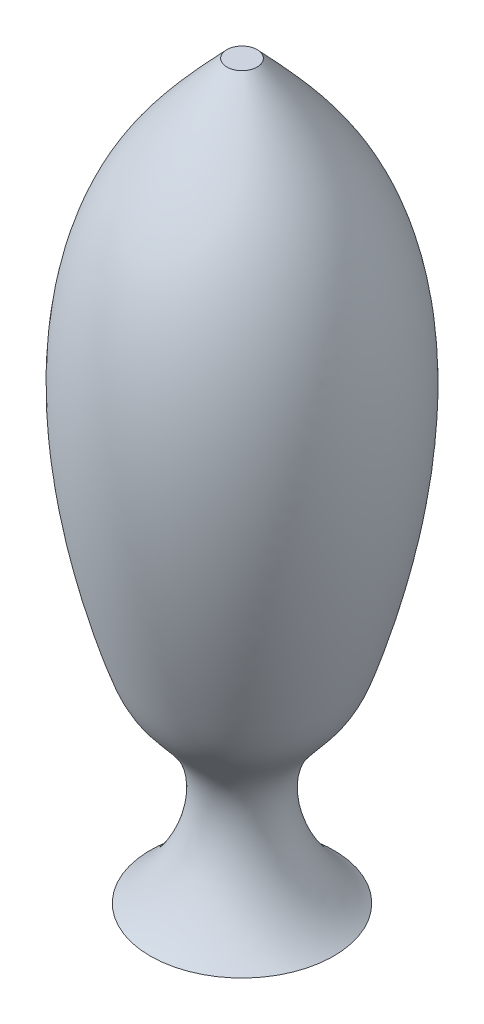
ISO-10303-21;
HEADER;
FILE_DESCRIPTION(('STEP AP214'),'2;1');
FILE_NAME('part.step','',(''),(''),'','','');
FILE_SCHEMA(('AUTOMOTIVE_DESIGN { 1 0 10303 214 1 1 1 1 }'));
ENDSEC;
DATA;
#1=APPLICATION_CONTEXT('core data for automotive mechanical design processes');
#2=APPLICATION_PROTOCOL_DEFINITION('international standard','automotive_design',2000,#1);
#3=PRODUCT_CONTEXT('',#1,'mechanical');
#4=PRODUCT('Part','Part','',(#3));
#5=PRODUCT_RELATED_PRODUCT_CATEGORY('part','',(#4));
#6=PRODUCT_DEFINITION_FORMATION('','',#4);
#7=PRODUCT_DEFINITION_CONTEXT('part definition',#1,'design');
#8=PRODUCT_DEFINITION('design','',#6,#7);
#9=PRODUCT_DEFINITION_SHAPE('','',#8);
#10=(LENGTH_UNIT() NAMED_UNIT(*) SI_UNIT(.MILLI.,.METRE.));
#11=(NAMED_UNIT(*) PLANE_ANGLE_UNIT() SI_UNIT($,.RADIAN.));
#12=(NAMED_UNIT(*) SI_UNIT($,.STERADIAN.) SOLID_ANGLE_UNIT());
#13=UNCERTAINTY_MEASURE_WITH_UNIT(LENGTH_MEASURE(1.E-05),#10,'distance_accuracy_value','');
#14=(GEOMETRIC_REPRESENTATION_CONTEXT(3) GLOBAL_UNCERTAINTY_ASSIGNED_CONTEXT((#13)) GLOBAL_UNIT_ASSIGNED_CONTEXT((#10,
#11,#12)) REPRESENTATION_CONTEXT('',''));
#15=CARTESIAN_POINT('',(0.,0.,0.));
#16=DIRECTION('',(0.,0.,1.));
#17=DIRECTION('',(1.,0.,0.));
#18=AXIS2_PLACEMENT_3D('',#15,#16,#17);
#19=CARTESIAN_POINT('',(0.,0.,0.));
#20=DIRECTION('',(0.,1.,0.));
#21=DIRECTION('',(0.,0.,1.));
#22=AXIS2_PLACEMENT_3D('',#19,#20,#21);
#23=PLANE('',#22);
#24=CARTESIAN_POINT('',(0.,0.,0.));
#25=DIRECTION('',(0.,1.,0.));
#26=DIRECTION('',(0.,0.,1.));
#27=AXIS2_PLACEMENT_3D('',#24,#25,#26);
#28=CIRCLE('',#27,5.01616220298674);
#29=CARTESIAN_POINT('',(0.,0.,5.01616220298674));
#30=VERTEX_POINT('',#29);
#31=EDGE_CURVE('E10',#30,#30,#28,.F.);
#32=ORIENTED_EDGE('',*,*,#31,.T.);
#33=EDGE_LOOP('',(#32));
#34=FACE_BOUND('',#33,.T.);
#35=ADVANCED_FACE('F32',(#34),#23,.F.);
#36=CARTESIAN_POINT('',(-1.49667697203888,40.5670535295192,0.));
#37=CARTESIAN_POINT('',(-2.43796033482869,40.6836093686175,0.));
#38=CARTESIAN_POINT('',(-5.27720795384494,41.0351835084826,0.));
#39=CARTESIAN_POINT('',(-23.2469505931272,42.3223995913611,0.));
#40=CARTESIAN_POINT('',(-21.6456127588909,-5.49249384441683,0.));
#41=CARTESIAN_POINT('',(-3.49218838161519,-0.0104092873740076,0.));
#42=CARTESIAN_POINT('',(-0.85432466918772,6.39545770960663,0.));
#43=CARTESIAN_POINT('',(-4.54184068574986,9.5023480739416,0.));
#44=CARTESIAN_POINT('',(-7.63720931771371,18.4867676987655,0.));
#45=CARTESIAN_POINT('',(-9.23861491785946,31.1003791504605,0.));
#46=CARTESIAN_POINT('',(-2.39692204611067,38.3383944499306,0.));
#47=CARTESIAN_POINT('',(-0.826298832810726,40.,0.));
#48=B_SPLINE_CURVE_WITH_KNOTS('',3,(#36,#37,#38,#39,#40,#41,#42,#43,#44,#45,#46,#47),
.UNSPECIFIED.,.F.,.F.,(4,1,1,1,1,1,1,1,1,4),(0.,0.0295143960297121,0.0890259851249221,
0.52126096071058,0.559678527248835,0.638292042370503,0.671570502998687,0.697833487821327,
0.930632703454226,1.),.UNSPECIFIED.);
#49=CARTESIAN_POINT('',(0.,40.,0.));
#50=DIRECTION('',(0.,1.,0.));
#51=AXIS1_PLACEMENT('',#49,#50);
#52=SURFACE_OF_REVOLUTION('',#48,#51);
#53=CARTESIAN_POINT('',(0.,40.,0.));
#54=DIRECTION('',(0.,1.,0.));
#55=DIRECTION('',(0.,0.,1.));
#56=AXIS2_PLACEMENT_3D('',#53,#54,#55);
#57=CIRCLE('',#56,0.826298832810726);
#58=CARTESIAN_POINT('',(0.,40.,0.826298832810726));
#59=VERTEX_POINT('',#58);
#60=EDGE_CURVE('E38',#59,#59,#57,.T.);
#61=ORIENTED_EDGE('',*,*,#60,.F.);
#62=EDGE_LOOP('',(#61));
#63=FACE_BOUND('',#62,.T.);
#64=ORIENTED_EDGE('',*,*,#31,.F.);
#65=EDGE_LOOP('',(#64));
#66=FACE_BOUND('',#65,.T.);
#67=ADVANCED_FACE('F52',(#63,#66),#52,.T.);
#68=CARTESIAN_POINT('',(0.,40.,0.));
#69=DIRECTION('',(0.,1.,0.));
#70=DIRECTION('',(0.,0.,1.));
#71=AXIS2_PLACEMENT_3D('',#68,#69,#70);
#72=PLANE('',#71);
#73=ORIENTED_EDGE('',*,*,#60,.T.);
#74=EDGE_LOOP('',(#73));
#75=FACE_BOUND('',#74,.T.);
#76=ADVANCED_FACE('F54',(#75),#72,.T.);
#77=CLOSED_SHELL('',(#35,#67,#76));
#78=MANIFOLD_SOLID_BREP('B2',#77);
#79=ADVANCED_BREP_SHAPE_REPRESENTATION('',(#18,#78),#14);
#80=SHAPE_DEFINITION_REPRESENTATION(#9,#79);
ENDSEC;
END-ISO-10303-21;
